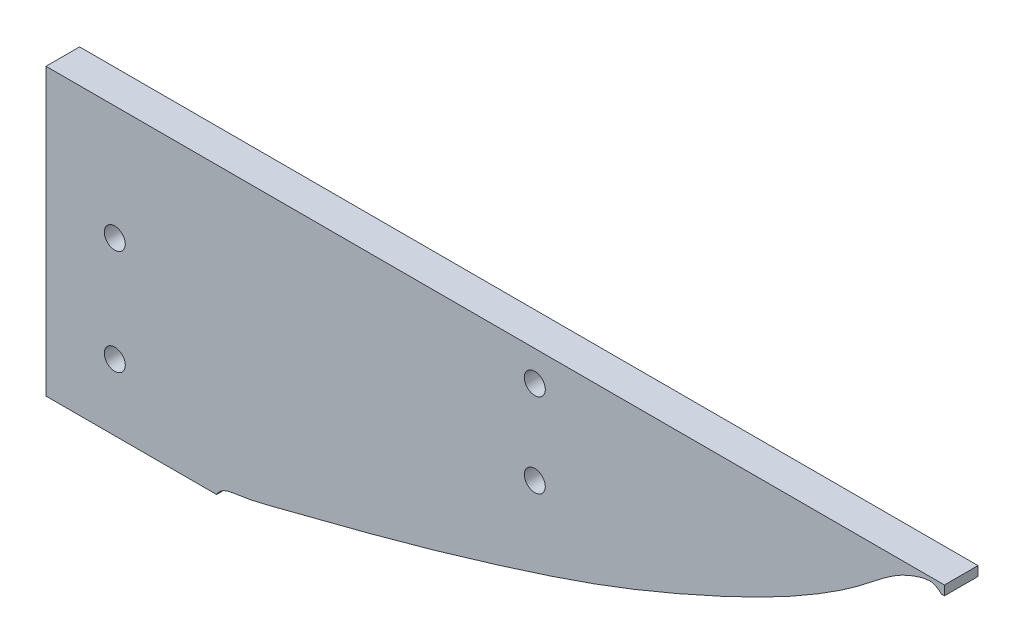
ISO-10303-21;
HEADER;
FILE_DESCRIPTION(('STEP AP214'),'2;1');
FILE_NAME('part.step','',(''),(''),'','','');
FILE_SCHEMA(('AUTOMOTIVE_DESIGN { 1 0 10303 214 1 1 1 1 }'));
ENDSEC;
DATA;
#1=APPLICATION_CONTEXT('core data for automotive mechanical design processes');
#2=APPLICATION_PROTOCOL_DEFINITION('international standard','automotive_design',2000,#1);
#3=PRODUCT_CONTEXT('',#1,'mechanical');
#4=PRODUCT('Part','Part','',(#3));
#5=PRODUCT_RELATED_PRODUCT_CATEGORY('part','',(#4));
#6=PRODUCT_DEFINITION_FORMATION('','',#4);
#7=PRODUCT_DEFINITION_CONTEXT('part definition',#1,'design');
#8=PRODUCT_DEFINITION('design','',#6,#7);
#9=PRODUCT_DEFINITION_SHAPE('','',#8);
#10=(LENGTH_UNIT() NAMED_UNIT(*) SI_UNIT(.MILLI.,.METRE.));
#11=(NAMED_UNIT(*) PLANE_ANGLE_UNIT() SI_UNIT($,.RADIAN.));
#12=(NAMED_UNIT(*) SI_UNIT($,.STERADIAN.) SOLID_ANGLE_UNIT());
#13=UNCERTAINTY_MEASURE_WITH_UNIT(LENGTH_MEASURE(1.E-05),#10,'distance_accuracy_value','');
#14=(GEOMETRIC_REPRESENTATION_CONTEXT(3) GLOBAL_UNCERTAINTY_ASSIGNED_CONTEXT((#13)) GLOBAL_UNIT_ASSIGNED_CONTEXT((#10,
#11,#12)) REPRESENTATION_CONTEXT('',''));
#15=CARTESIAN_POINT('',(0.,0.,0.));
#16=DIRECTION('',(0.,0.,1.));
#17=DIRECTION('',(1.,0.,0.));
#18=AXIS2_PLACEMENT_3D('',#15,#16,#17);
#19=CARTESIAN_POINT('',(-96.0676041626263,-65.803450933749,220.));
#20=DIRECTION('',(0.,0.,-1.));
#21=DIRECTION('',(-1.,0.,0.));
#22=AXIS2_PLACEMENT_3D('',#19,#20,#21);
#23=PLANE('',#22);
#24=CARTESIAN_POINT('',(-100.,-50.,220.));
#25=DIRECTION('',(0.,0.,-1.));
#26=DIRECTION('',(-1.,0.,0.));
#27=AXIS2_PLACEMENT_3D('',#24,#25,#26);
#28=CIRCLE('',#27,2.5);
#29=CARTESIAN_POINT('',(-102.5,-50.,220.));
#30=VERTEX_POINT('',#29);
#31=EDGE_CURVE('E182',#30,#30,#28,.F.);
#32=ORIENTED_EDGE('',*,*,#31,.F.);
#33=EDGE_LOOP('',(#32));
#34=FACE_BOUND('',#33,.T.);
#35=CARTESIAN_POINT('',(0.0705666698621599,-4.96037406111782,220.));
#36=DIRECTION('',(0.,0.,-1.));
#37=DIRECTION('',(-1.,0.,0.));
#38=AXIS2_PLACEMENT_3D('',#35,#36,#37);
#39=CIRCLE('',#38,2.5);
#40=CARTESIAN_POINT('',(-2.42943333013784,-4.96037406111782,220.));
#41=VERTEX_POINT('',#40);
#42=EDGE_CURVE('E160',#41,#41,#39,.F.);
#43=ORIENTED_EDGE('',*,*,#42,.F.);
#44=EDGE_LOOP('',(#43));
#45=FACE_BOUND('',#44,.T.);
#46=DIRECTION('',(-1.,0.,0.));
#47=VECTOR('',#46,1.);
#48=CARTESIAN_POINT('',(97.6718811957973,2.25600000000004,220.));
#49=LINE('',#48,#47);
#50=CARTESIAN_POINT('',(97.6718811957973,2.25600000000004,220.));
#51=VERTEX_POINT('',#50);
#52=CARTESIAN_POINT('',(-116.387505590424,2.25600000000002,220.));
#53=VERTEX_POINT('',#52);
#54=EDGE_CURVE('E162',#51,#53,#49,.T.);
#55=ORIENTED_EDGE('',*,*,#54,.T.);
#56=DIRECTION('',(0.,-1.,0.));
#57=VECTOR('',#56,1.);
#58=CARTESIAN_POINT('',(-116.387505590425,-65.8090437288478,220.));
#59=LINE('',#58,#57);
#60=CARTESIAN_POINT('',(-116.387505590424,-65.8090437288456,220.));
#61=VERTEX_POINT('',#60);
#62=EDGE_CURVE('E86',#53,#61,#59,.T.);
#63=ORIENTED_EDGE('',*,*,#62,.T.);
#64=CARTESIAN_POINT('',(-75.7477041953337,-65.7939819771318,220.));
#65=CARTESIAN_POINT('',(-89.2943034089604,-65.8016703311369,220.));
#66=CARTESIAN_POINT('',(-102.840904429457,-65.8065235902015,220.));
#67=CARTESIAN_POINT('',(-116.387505590424,-65.8090437288456,220.));
#68=B_SPLINE_CURVE_WITH_KNOTS('',3,(#64,#65,#66,#67),.UNSPECIFIED.,.F.,.F.,(4,4),(0.,1.),.UNSPECIFIED.);
#69=CARTESIAN_POINT('',(-75.7477041953337,-65.7939819771319,220.));
#70=VERTEX_POINT('',#69);
#71=EDGE_CURVE('E100',#61,#70,#68,.F.);
#72=ORIENTED_EDGE('',*,*,#71,.T.);
#73=CARTESIAN_POINT('',(96.9016350651795,0.,220.));
#74=CARTESIAN_POINT('',(96.8519426476901,0.115580432964573,220.));
#75=CARTESIAN_POINT('',(96.7671221044327,0.209643179401753,220.));
#76=CARTESIAN_POINT('',(96.5767674993844,0.371275910920587,220.));
#77=CARTESIAN_POINT('',(96.4745875250812,0.442321053647506,220.));
#78=CARTESIAN_POINT('',(96.1693026681454,0.657207746193641,220.));
#79=CARTESIAN_POINT('',(95.9702487323123,0.807385935867797,220.));
#80=CARTESIAN_POINT('',(95.6496859316117,0.999858758834776,220.));
#81=CARTESIAN_POINT('',(95.5408893391914,1.05930922256229,220.));
#82=CARTESIAN_POINT('',(95.3160449660068,1.1606372010778,220.));
#83=CARTESIAN_POINT('',(95.1996320162228,1.20162974415744,220.));
#84=CARTESIAN_POINT('',(94.9593856054094,1.26563153447224,220.));
#85=CARTESIAN_POINT('',(94.8354442643088,1.28864097382315,220.));
#86=CARTESIAN_POINT('',(94.5892813957704,1.31904624620934,220.));
#87=CARTESIAN_POINT('',(94.4659754855689,1.32679461275816,220.));
#88=CARTESIAN_POINT('',(94.0955770629955,1.33407716571005,220.));
#89=CARTESIAN_POINT('',(93.8471649392338,1.31812336366658,220.));
#90=CARTESIAN_POINT('',(93.3536048685711,1.2636145657441,220.));
#91=CARTESIAN_POINT('',(93.1096207271646,1.22614332730666,220.));
#92=CARTESIAN_POINT('',(92.3847475020459,1.08786059021633,220.));
#93=CARTESIAN_POINT('',(91.9110828783317,0.960649253056396,220.));
#94=CARTESIAN_POINT('',(90.9726392580765,0.673756453290501,220.));
#95=CARTESIAN_POINT('',(90.5080638687369,0.51333096313959,220.));
#96=CARTESIAN_POINT('',(89.5873315899863,0.161716847787321,220.));
#97=CARTESIAN_POINT('',(89.1319799253835,-0.0287056040000631,220.));
#98=CARTESIAN_POINT('',(87.7924042462448,-0.634505113679846,220.));
#99=CARTESIAN_POINT('',(86.9302436730784,-1.08770577406354,220.));
#100=CARTESIAN_POINT('',(84.4334177181907,-2.59049724941425,220.));
#101=CARTESIAN_POINT('',(82.8837277820443,-3.77580260681919,220.));
#102=CARTESIAN_POINT('',(80.5798457159318,-5.58674535344837,220.));
#103=CARTESIAN_POINT('',(79.814695595115,-6.19476887542515,220.));
#104=CARTESIAN_POINT('',(78.2723656884322,-7.3924923720122,220.));
#105=CARTESIAN_POINT('',(77.4965656666596,-7.98433573298842,220.));
#106=CARTESIAN_POINT('',(75.1431177743237,-9.72042438339154,220.));
#107=CARTESIAN_POINT('',(73.5383240125928,-10.8235655594466,220.));
#108=CARTESIAN_POINT('',(70.280654815684,-12.9570429870735,220.));
#109=CARTESIAN_POINT('',(68.6282897403805,-13.9881520219005,220.));
#110=CARTESIAN_POINT('',(65.2881491874631,-15.9967519147882,220.));
#111=CARTESIAN_POINT('',(63.5999756789349,-16.973640077298,220.));
#112=CARTESIAN_POINT('',(60.1874334485067,-18.8726098702804,220.));
#113=CARTESIAN_POINT('',(58.4654185994864,-19.7943329413585,220.));
#114=CARTESIAN_POINT('',(53.2664358077166,-22.4921109490717,220.));
#115=CARTESIAN_POINT('',(49.7556400675122,-24.2055662813208,220.));
#116=CARTESIAN_POINT('',(42.6865252467364,-27.5271921669619,220.));
#117=CARTESIAN_POINT('',(39.1257110228588,-29.1335060135173,220.));
#118=CARTESIAN_POINT('',(31.966138282809,-32.2522740454603,220.));
#119=CARTESIAN_POINT('',(28.3672617030794,-33.7657878974137,220.));
#120=CARTESIAN_POINT('',(21.1202291743394,-36.6744065955221,220.));
#121=CARTESIAN_POINT('',(17.4694327724455,-38.0666070753575,220.));
#122=CARTESIAN_POINT('',(10.1229512957571,-40.7156149762488,220.));
#123=CARTESIAN_POINT('',(6.42715248231211,-41.974349060396,220.));
#124=CARTESIAN_POINT('',(-0.992345631584921,-44.4104711345787,220.));
#125=CARTESIAN_POINT('',(-4.7156781915297,-45.5899026583605,220.));
#126=CARTESIAN_POINT('',(-12.1761787893773,-47.9005413199485,220.));
#127=CARTESIAN_POINT('',(-15.9138133458315,-49.0312979978328,220.));
#128=CARTESIAN_POINT('',(-23.4071909849534,-51.232575989077,220.));
#129=CARTESIAN_POINT('',(-27.1636179876737,-52.3015749490052,220.));
#130=CARTESIAN_POINT('',(-34.6925413758234,-54.3802192994758,220.));
#131=CARTESIAN_POINT('',(-38.4650354527324,-55.3905489459171,220.));
#132=CARTESIAN_POINT('',(-46.0184374373603,-57.3790586985937,220.));
#133=CARTESIAN_POINT('',(-49.7988723167312,-58.3590837743564,220.));
#134=CARTESIAN_POINT('',(-55.4705849201684,-59.8249399342256,220.));
#135=CARTESIAN_POINT('',(-57.3616562523801,-60.3116131457572,220.));
#136=CARTESIAN_POINT('',(-60.2001383597751,-61.0342441699398,220.));
#137=CARTESIAN_POINT('',(-61.146613113292,-61.2738875859992,220.));
#138=CARTESIAN_POINT('',(-63.0401604267531,-61.7508262354819,220.));
#139=CARTESIAN_POINT('',(-63.9866690168645,-61.9907683592398,220.));
#140=CARTESIAN_POINT('',(-65.8837594087793,-62.4520084244785,220.));
#141=CARTESIAN_POINT('',(-66.8350179852565,-62.6702125440466,220.));
#142=CARTESIAN_POINT('',(-68.2715899770282,-62.9532060003478,220.));
#143=CARTESIAN_POINT('',(-68.7520477798749,-63.0404306741266,220.));
#144=CARTESIAN_POINT('',(-69.7161461141448,-63.1993834278871,220.));
#145=CARTESIAN_POINT('',(-70.2001060126121,-63.2681421930626,220.));
#146=CARTESIAN_POINT('',(-71.1688081802134,-63.4012712754548,220.));
#147=CARTESIAN_POINT('',(-71.6529122562588,-63.4692213244741,220.));
#148=CARTESIAN_POINT('',(-72.3730687496702,-63.6047992739907,220.));
#149=CARTESIAN_POINT('',(-72.6121498036645,-63.6554390449552,220.));
#150=CARTESIAN_POINT('',(-73.0871744694479,-63.7743170251005,220.));
#151=CARTESIAN_POINT('',(-73.3245358259932,-63.8435241811373,220.));
#152=CARTESIAN_POINT('',(-73.7848114982297,-64.012105977356,220.));
#153=CARTESIAN_POINT('',(-74.0073043108915,-64.111205261717,220.));
#154=CARTESIAN_POINT('',(-74.3242560296515,-64.2923715231059,220.));
#155=CARTESIAN_POINT('',(-74.4270510955057,-64.3582913850557,220.));
#156=CARTESIAN_POINT('',(-74.6261524425066,-64.5026998644083,220.));
#157=CARTESIAN_POINT('',(-74.7229365233919,-64.5810113275943,220.));
#158=CARTESIAN_POINT('',(-75.0027466027724,-64.8245750280937,220.));
#159=CARTESIAN_POINT('',(-75.1734469269677,-65.0030359879642,220.));
#160=CARTESIAN_POINT('',(-75.4265759001549,-65.273694208654,220.));
#161=CARTESIAN_POINT('',(-75.5100934372054,-65.3657353714749,220.));
#162=CARTESIAN_POINT('',(-75.6575606172261,-65.5632982330442,220.));
#163=CARTESIAN_POINT('',(-75.7211614363312,-65.6737730253671,220.));
#164=CARTESIAN_POINT('',(-75.7477041953337,-65.7939819771319,220.));
#165=B_SPLINE_CURVE_WITH_KNOTS('',3,(#73,#74,#75,#76,#77,#78,#79,#80,#81,#82,#83,#84,#85,#86,
#87,#88,#89,#90,#91,#92,#93,#94,#95,#96,#97,#98,#99,#100,#101,#102,#103,#104,#105,#106,#107,
#108,#109,#110,#111,#112,#113,#114,#115,#116,#117,#118,#119,#120,#121,#122,#123,#124,#125,#126,
#127,#128,#129,#130,#131,#132,#133,#134,#135,#136,#137,#138,#139,#140,#141,#142,#143,#144,#145,
#146,#147,#148,#149,#150,#151,#152,#153,#154,#155,#156,#157,#158,#159,#160,#161,#162,#163,#164),
.UNSPECIFIED.,.F.,.F.,(4,2,2,2,2,2,2,2,2,2,2,2,2,2,2,2,2,2,2,2,2,2,2,2,2,2,2,2,2,2,2,2,2,2,2,2,
2,2,2,2,2,2,2,2,2,4),(0.,0.001953125,0.00390625,0.00781250000000011,0.00976562500000011,
0.0117187500000002,0.0136718750000003,0.0156250000000003,0.0195312500000003,0.0234375000000002,
0.0312500000000002,0.0390625000000003,0.0468750000000003,0.0625000000000004,0.0937500000000009,
0.109375000000001,0.125000000000001,0.156250000000001,0.187500000000002,0.218750000000002,
0.250000000000002,0.312500000000002,0.375000000000002,0.437500000000002,0.500000000000003,
0.562500000000003,0.625000000000003,0.687500000000003,0.750000000000003,0.812500000000003,
0.875000000000003,0.906250000000003,0.921875000000003,0.937500000000003,0.953125000000003,
0.960937500000003,0.968750000000003,0.976562500000002,0.980468750000002,0.984375000000002,
0.988281250000002,0.990234375000001,0.992187500000001,0.996093750000001,0.998046875,1.),.UNSPECIFIED.);
#166=CARTESIAN_POINT('',(96.9016350651795,0.,220.));
#167=VERTEX_POINT('',#166);
#168=EDGE_CURVE('E93',#70,#167,#165,.F.);
#169=ORIENTED_EDGE('',*,*,#168,.T.);
#170=DIRECTION('',(1.,0.,0.));
#171=VECTOR('',#170,1.);
#172=CARTESIAN_POINT('',(96.9016350651795,0.,220.));
#173=LINE('',#172,#171);
#174=CARTESIAN_POINT('',(97.6718811957973,0.,220.));
#175=VERTEX_POINT('',#174);
#176=EDGE_CURVE('E98',#167,#175,#173,.T.);
#177=ORIENTED_EDGE('',*,*,#176,.T.);
#178=DIRECTION('',(0.,1.,0.));
#179=VECTOR('',#178,1.);
#180=CARTESIAN_POINT('',(97.6718811957973,2.25600000000004,220.));
#181=LINE('',#180,#179);
#182=EDGE_CURVE('E49',#175,#51,#181,.T.);
#183=ORIENTED_EDGE('',*,*,#182,.T.);
#184=EDGE_LOOP('',(#55,#63,#72,#169,#177,#183));
#185=FACE_BOUND('',#184,.T.);
#186=CARTESIAN_POINT('',(0.0705666698621599,-25.,220.));
#187=DIRECTION('',(0.,0.,-1.));
#188=DIRECTION('',(-1.,0.,0.));
#189=AXIS2_PLACEMENT_3D('',#186,#187,#188);
#190=CIRCLE('',#189,2.5);
#191=CARTESIAN_POINT('',(-2.42943333013784,-25.,220.));
#192=VERTEX_POINT('',#191);
#193=EDGE_CURVE('E178',#192,#192,#190,.F.);
#194=ORIENTED_EDGE('',*,*,#193,.F.);
#195=EDGE_LOOP('',(#194));
#196=FACE_BOUND('',#195,.T.);
#197=CARTESIAN_POINT('',(-100.,-25.,220.));
#198=DIRECTION('',(0.,0.,-1.));
#199=DIRECTION('',(-1.,0.,0.));
#200=AXIS2_PLACEMENT_3D('',#197,#198,#199);
#201=CIRCLE('',#200,2.5);
#202=CARTESIAN_POINT('',(-102.5,-25.,220.));
#203=VERTEX_POINT('',#202);
#204=EDGE_CURVE('E186',#203,#203,#201,.F.);
#205=ORIENTED_EDGE('',*,*,#204,.F.);
#206=EDGE_LOOP('',(#205));
#207=FACE_BOUND('',#206,.T.);
#208=ADVANCED_FACE('F30',(#34,#45,#185,#196,#207),#23,.F.);
#209=CARTESIAN_POINT('',(-96.0676041626263,-65.803450933749,212.));
#210=DIRECTION('',(0.,0.,-1.));
#211=DIRECTION('',(-1.,0.,0.));
#212=AXIS2_PLACEMENT_3D('',#209,#210,#211);
#213=PLANE('',#212);
#214=CARTESIAN_POINT('',(-100.,-50.,212.));
#215=DIRECTION('',(0.,0.,-1.));
#216=DIRECTION('',(-1.,0.,0.));
#217=AXIS2_PLACEMENT_3D('',#214,#215,#216);
#218=CIRCLE('',#217,2.5);
#219=CARTESIAN_POINT('',(-102.5,-50.,212.));
#220=VERTEX_POINT('',#219);
#221=EDGE_CURVE('E185',#220,#220,#218,.F.);
#222=ORIENTED_EDGE('',*,*,#221,.T.);
#223=EDGE_LOOP('',(#222));
#224=FACE_BOUND('',#223,.T.);
#225=CARTESIAN_POINT('',(0.0705666698621599,-4.96037406111782,212.));
#226=DIRECTION('',(0.,0.,-1.));
#227=DIRECTION('',(-1.,0.,0.));
#228=AXIS2_PLACEMENT_3D('',#225,#226,#227);
#229=CIRCLE('',#228,2.5);
#230=CARTESIAN_POINT('',(-2.42943333013784,-4.96037406111782,212.));
#231=VERTEX_POINT('',#230);
#232=EDGE_CURVE('E177',#231,#231,#229,.F.);
#233=ORIENTED_EDGE('',*,*,#232,.T.);
#234=EDGE_LOOP('',(#233));
#235=FACE_BOUND('',#234,.T.);
#236=DIRECTION('',(-1.,0.,0.));
#237=VECTOR('',#236,1.);
#238=CARTESIAN_POINT('',(97.6718811957973,2.25600000000004,212.));
#239=LINE('',#238,#237);
#240=CARTESIAN_POINT('',(97.6718811957973,2.25600000000004,212.));
#241=VERTEX_POINT('',#240);
#242=CARTESIAN_POINT('',(-116.387505590424,2.25600000000002,212.));
#243=VERTEX_POINT('',#242);
#244=EDGE_CURVE('E156',#241,#243,#239,.T.);
#245=ORIENTED_EDGE('',*,*,#244,.F.);
#246=DIRECTION('',(0.,1.,0.));
#247=VECTOR('',#246,1.);
#248=CARTESIAN_POINT('',(97.6718811957973,2.25600000000004,212.));
#249=LINE('',#248,#247);
#250=CARTESIAN_POINT('',(97.6718811957973,0.,212.));
#251=VERTEX_POINT('',#250);
#252=EDGE_CURVE('E78',#251,#241,#249,.T.);
#253=ORIENTED_EDGE('',*,*,#252,.F.);
#254=DIRECTION('',(1.,0.,0.));
#255=VECTOR('',#254,1.);
#256=CARTESIAN_POINT('',(96.9016350651795,0.,212.));
#257=LINE('',#256,#255);
#258=CARTESIAN_POINT('',(96.9016350651795,0.,212.));
#259=VERTEX_POINT('',#258);
#260=EDGE_CURVE('E72',#259,#251,#257,.T.);
#261=ORIENTED_EDGE('',*,*,#260,.F.);
#262=CARTESIAN_POINT('',(-75.7477041953337,-65.7939819771319,212.));
#263=CARTESIAN_POINT('',(-75.7211614363312,-65.6737730253671,212.));
#264=CARTESIAN_POINT('',(-75.6575606172261,-65.5632982330442,212.));
#265=CARTESIAN_POINT('',(-75.5100934372054,-65.3657353714749,212.));
#266=CARTESIAN_POINT('',(-75.4265759001549,-65.273694208654,212.));
#267=CARTESIAN_POINT('',(-75.1734469269677,-65.0030359879642,212.));
#268=CARTESIAN_POINT('',(-75.0027466027724,-64.8245750280937,212.));
#269=CARTESIAN_POINT('',(-74.7229365233919,-64.5810113275943,212.));
#270=CARTESIAN_POINT('',(-74.6261524425066,-64.5026998644083,212.));
#271=CARTESIAN_POINT('',(-74.4270510955057,-64.3582913850557,212.));
#272=CARTESIAN_POINT('',(-74.3242560296515,-64.2923715231059,212.));
#273=CARTESIAN_POINT('',(-74.0073043108915,-64.111205261717,212.));
#274=CARTESIAN_POINT('',(-73.7848114982297,-64.012105977356,212.));
#275=CARTESIAN_POINT('',(-73.3245358259932,-63.8435241811373,212.));
#276=CARTESIAN_POINT('',(-73.0871744694479,-63.7743170251005,212.));
#277=CARTESIAN_POINT('',(-72.6121498036645,-63.6554390449552,212.));
#278=CARTESIAN_POINT('',(-72.3730687496702,-63.6047992739907,212.));
#279=CARTESIAN_POINT('',(-71.6529122562588,-63.4692213244741,212.));
#280=CARTESIAN_POINT('',(-71.1688081802134,-63.4012712754548,212.));
#281=CARTESIAN_POINT('',(-70.2001060126121,-63.2681421930626,212.));
#282=CARTESIAN_POINT('',(-69.7161461141448,-63.1993834278871,212.));
#283=CARTESIAN_POINT('',(-68.7520477798749,-63.0404306741266,212.));
#284=CARTESIAN_POINT('',(-68.2715899770282,-62.9532060003478,212.));
#285=CARTESIAN_POINT('',(-66.8350179852565,-62.6702125440466,212.));
#286=CARTESIAN_POINT('',(-65.8837594087793,-62.4520084244785,212.));
#287=CARTESIAN_POINT('',(-63.9866690168645,-61.9907683592398,212.));
#288=CARTESIAN_POINT('',(-63.0401604267531,-61.7508262354819,212.));
#289=CARTESIAN_POINT('',(-61.146613113292,-61.2738875859992,212.));
#290=CARTESIAN_POINT('',(-60.2001383597751,-61.0342441699398,212.));
#291=CARTESIAN_POINT('',(-57.3616562523801,-60.3116131457572,212.));
#292=CARTESIAN_POINT('',(-55.4705849201684,-59.8249399342256,212.));
#293=CARTESIAN_POINT('',(-49.7988723167312,-58.3590837743564,212.));
#294=CARTESIAN_POINT('',(-46.0184374373603,-57.3790586985937,212.));
#295=CARTESIAN_POINT('',(-38.4650354527324,-55.3905489459171,212.));
#296=CARTESIAN_POINT('',(-34.6925413758234,-54.3802192994758,212.));
#297=CARTESIAN_POINT('',(-27.1636179876737,-52.3015749490052,212.));
#298=CARTESIAN_POINT('',(-23.4071909849534,-51.232575989077,212.));
#299=CARTESIAN_POINT('',(-15.9138133458315,-49.0312979978328,212.));
#300=CARTESIAN_POINT('',(-12.1761787893773,-47.9005413199485,212.));
#301=CARTESIAN_POINT('',(-4.7156781915297,-45.5899026583605,212.));
#302=CARTESIAN_POINT('',(-0.992345631584921,-44.4104711345787,212.));
#303=CARTESIAN_POINT('',(6.42715248231211,-41.974349060396,212.));
#304=CARTESIAN_POINT('',(10.1229512957571,-40.7156149762488,212.));
#305=CARTESIAN_POINT('',(17.4694327724455,-38.0666070753575,212.));
#306=CARTESIAN_POINT('',(21.1202291743394,-36.6744065955221,212.));
#307=CARTESIAN_POINT('',(28.3672617030794,-33.7657878974137,212.));
#308=CARTESIAN_POINT('',(31.966138282809,-32.2522740454603,212.));
#309=CARTESIAN_POINT('',(39.1257110228588,-29.1335060135173,212.));
#310=CARTESIAN_POINT('',(42.6865252467364,-27.5271921669619,212.));
#311=CARTESIAN_POINT('',(49.7556400675122,-24.2055662813208,212.));
#312=CARTESIAN_POINT('',(53.2664358077166,-22.4921109490717,212.));
#313=CARTESIAN_POINT('',(58.4654185994864,-19.7943329413585,212.));
#314=CARTESIAN_POINT('',(60.1874334485067,-18.8726098702804,212.));
#315=CARTESIAN_POINT('',(63.5999756789349,-16.973640077298,212.));
#316=CARTESIAN_POINT('',(65.2881491874631,-15.9967519147882,212.));
#317=CARTESIAN_POINT('',(68.6282897403805,-13.9881520219005,212.));
#318=CARTESIAN_POINT('',(70.280654815684,-12.9570429870735,212.));
#319=CARTESIAN_POINT('',(73.5383240125928,-10.8235655594466,212.));
#320=CARTESIAN_POINT('',(75.1431177743237,-9.72042438339154,212.));
#321=CARTESIAN_POINT('',(77.4965656666596,-7.98433573298842,212.));
#322=CARTESIAN_POINT('',(78.2723656884322,-7.3924923720122,212.));
#323=CARTESIAN_POINT('',(79.814695595115,-6.19476887542515,212.));
#324=CARTESIAN_POINT('',(80.5798457159318,-5.58674535344837,212.));
#325=CARTESIAN_POINT('',(82.8837277820443,-3.77580260681919,212.));
#326=CARTESIAN_POINT('',(84.4334177181907,-2.59049724941425,212.));
#327=CARTESIAN_POINT('',(86.9302436730784,-1.08770577406354,212.));
#328=CARTESIAN_POINT('',(87.7924042462448,-0.634505113679846,212.));
#329=CARTESIAN_POINT('',(89.1319799253835,-0.0287056040000631,212.));
#330=CARTESIAN_POINT('',(89.5873315899863,0.161716847787321,212.));
#331=CARTESIAN_POINT('',(90.5080638687369,0.51333096313959,212.));
#332=CARTESIAN_POINT('',(90.9726392580765,0.673756453290501,212.));
#333=CARTESIAN_POINT('',(91.9110828783317,0.960649253056396,212.));
#334=CARTESIAN_POINT('',(92.3847475020459,1.08786059021633,212.));
#335=CARTESIAN_POINT('',(93.1096207271646,1.22614332730666,212.));
#336=CARTESIAN_POINT('',(93.3536048685711,1.2636145657441,212.));
#337=CARTESIAN_POINT('',(93.8471649392338,1.31812336366658,212.));
#338=CARTESIAN_POINT('',(94.0955770629955,1.33407716571005,212.));
#339=CARTESIAN_POINT('',(94.4659754855689,1.32679461275816,212.));
#340=CARTESIAN_POINT('',(94.5892813957704,1.31904624620934,212.));
#341=CARTESIAN_POINT('',(94.8354442643088,1.28864097382315,212.));
#342=CARTESIAN_POINT('',(94.9593856054094,1.26563153447224,212.));
#343=CARTESIAN_POINT('',(95.1996320162228,1.20162974415744,212.));
#344=CARTESIAN_POINT('',(95.3160449660068,1.1606372010778,212.));
#345=CARTESIAN_POINT('',(95.5408893391914,1.05930922256229,212.));
#346=CARTESIAN_POINT('',(95.6496859316117,0.999858758834776,212.));
#347=CARTESIAN_POINT('',(95.9702487323123,0.807385935867797,212.));
#348=CARTESIAN_POINT('',(96.1693026681454,0.657207746193641,212.));
#349=CARTESIAN_POINT('',(96.4745875250812,0.442321053647506,212.));
#350=CARTESIAN_POINT('',(96.5767674993844,0.371275910920587,212.));
#351=CARTESIAN_POINT('',(96.7671221044327,0.209643179401753,212.));
#352=CARTESIAN_POINT('',(96.8519426476901,0.115580432964573,212.));
#353=CARTESIAN_POINT('',(96.9016350651795,0.,212.));
#354=B_SPLINE_CURVE_WITH_KNOTS('',3,(#262,#263,#264,#265,#266,#267,#268,#269,#270,#271,#272,
#273,#274,#275,#276,#277,#278,#279,#280,#281,#282,#283,#284,#285,#286,#287,#288,#289,#290,#291,
#292,#293,#294,#295,#296,#297,#298,#299,#300,#301,#302,#303,#304,#305,#306,#307,#308,#309,#310,
#311,#312,#313,#314,#315,#316,#317,#318,#319,#320,#321,#322,#323,#324,#325,#326,#327,#328,#329,
#330,#331,#332,#333,#334,#335,#336,#337,#338,#339,#340,#341,#342,#343,#344,#345,#346,#347,#348,
#349,#350,#351,#352,#353),.UNSPECIFIED.,.F.,.F.,(4,2,2,2,2,2,2,2,2,2,2,2,2,2,2,2,2,2,2,2,2,2,2,
2,2,2,2,2,2,2,2,2,2,2,2,2,2,2,2,2,2,2,2,2,2,4),(0.,0.00195312499999967,0.00390624999999944,
0.00781249999999878,0.00976562499999856,0.0117187499999983,0.0156249999999981,
0.0195312499999978,0.0234374999999976,0.0312499999999973,0.0390624999999971,0.046874999999997,
0.0624999999999969,0.0781249999999969,0.0937499999999969,0.124999999999997,0.187499999999997,
0.249999999999997,0.312499999999997,0.374999999999997,0.437499999999997,0.499999999999997,
0.562499999999998,0.624999999999998,0.687499999999998,0.749999999999998,0.781249999999998,
0.812499999999998,0.843749999999999,0.874999999999999,0.890624999999999,0.906249999999999,
0.9375,0.953125,0.9609375,0.96875,0.9765625,0.98046875,0.984375,0.986328125,0.98828125,
0.990234375,0.9921875,0.99609375,0.998046875,1.),.UNSPECIFIED.);
#355=CARTESIAN_POINT('',(-75.7477041953337,-65.7939819771319,212.));
#356=VERTEX_POINT('',#355);
#357=EDGE_CURVE('E110',#356,#259,#354,.T.);
#358=ORIENTED_EDGE('',*,*,#357,.F.);
#359=CARTESIAN_POINT('',(-116.387505590424,-65.8090437288456,212.));
#360=CARTESIAN_POINT('',(-102.840904429457,-65.8065235902015,212.));
#361=CARTESIAN_POINT('',(-89.2943034089604,-65.8016703311369,212.));
#362=CARTESIAN_POINT('',(-75.7477041953337,-65.7939819771318,212.));
#363=B_SPLINE_CURVE_WITH_KNOTS('',3,(#359,#360,#361,#362),.UNSPECIFIED.,.F.,.F.,(4,4),(0.,1.),.UNSPECIFIED.);
#364=CARTESIAN_POINT('',(-116.387505590424,-65.8090437288456,212.));
#365=VERTEX_POINT('',#364);
#366=EDGE_CURVE('E250',#365,#356,#363,.T.);
#367=ORIENTED_EDGE('',*,*,#366,.F.);
#368=DIRECTION('',(0.,-1.,0.));
#369=VECTOR('',#368,1.);
#370=CARTESIAN_POINT('',(-116.387505590425,-65.8090437288478,212.));
#371=LINE('',#370,#369);
#372=EDGE_CURVE('E159',#243,#365,#371,.T.);
#373=ORIENTED_EDGE('',*,*,#372,.F.);
#374=EDGE_LOOP('',(#245,#253,#261,#358,#367,#373));
#375=FACE_BOUND('',#374,.T.);
#376=CARTESIAN_POINT('',(0.0705666698621599,-25.,212.));
#377=DIRECTION('',(0.,0.,-1.));
#378=DIRECTION('',(-1.,0.,0.));
#379=AXIS2_PLACEMENT_3D('',#376,#377,#378);
#380=CIRCLE('',#379,2.5);
#381=CARTESIAN_POINT('',(-2.42943333013784,-25.,212.));
#382=VERTEX_POINT('',#381);
#383=EDGE_CURVE('E181',#382,#382,#380,.F.);
#384=ORIENTED_EDGE('',*,*,#383,.T.);
#385=EDGE_LOOP('',(#384));
#386=FACE_BOUND('',#385,.T.);
#387=CARTESIAN_POINT('',(-100.,-25.,212.));
#388=DIRECTION('',(0.,0.,-1.));
#389=DIRECTION('',(-1.,0.,0.));
#390=AXIS2_PLACEMENT_3D('',#387,#388,#389);
#391=CIRCLE('',#390,2.5);
#392=CARTESIAN_POINT('',(-102.5,-25.,212.));
#393=VERTEX_POINT('',#392);
#394=EDGE_CURVE('E34',#393,#393,#391,.F.);
#395=ORIENTED_EDGE('',*,*,#394,.T.);
#396=EDGE_LOOP('',(#395));
#397=FACE_BOUND('',#396,.T.);
#398=ADVANCED_FACE('F167',(#224,#235,#375,#386,#397),#213,.T.);
#399=CARTESIAN_POINT('',(97.6718811957973,2.25600000000004,220.));
#400=DIRECTION('',(0.,-1.,0.));
#401=DIRECTION('',(1.,0.,0.));
#402=AXIS2_PLACEMENT_3D('',#399,#400,#401);
#403=PLANE('',#402);
#404=ORIENTED_EDGE('',*,*,#244,.T.);
#405=DIRECTION('',(0.,0.,-1.));
#406=VECTOR('',#405,1.);
#407=CARTESIAN_POINT('',(-116.387505590424,2.25600000000002,220.));
#408=LINE('',#407,#406);
#409=EDGE_CURVE('E11',#53,#243,#408,.T.);
#410=ORIENTED_EDGE('',*,*,#409,.F.);
#411=ORIENTED_EDGE('',*,*,#54,.F.);
#412=DIRECTION('',(0.,0.,-1.));
#413=VECTOR('',#412,1.);
#414=CARTESIAN_POINT('',(97.6718811957973,2.25600000000004,220.));
#415=LINE('',#414,#413);
#416=EDGE_CURVE('E117',#51,#241,#415,.T.);
#417=ORIENTED_EDGE('',*,*,#416,.T.);
#418=EDGE_LOOP('',(#404,#410,#411,#417));
#419=FACE_BOUND('',#418,.T.);
#420=ADVANCED_FACE('F32',(#419),#403,.F.);
#421=CARTESIAN_POINT('',(-116.387505590425,-65.8090437288478,220.));
#422=DIRECTION('',(1.,0.,0.));
#423=DIRECTION('',(0.,1.,0.));
#424=AXIS2_PLACEMENT_3D('',#421,#422,#423);
#425=PLANE('',#424);
#426=ORIENTED_EDGE('',*,*,#372,.T.);
#427=DIRECTION('',(0.,0.,-1.));
#428=VECTOR('',#427,1.);
#429=CARTESIAN_POINT('',(-116.387505590424,-65.8090437288456,220.));
#430=LINE('',#429,#428);
#431=EDGE_CURVE('E40',#61,#365,#430,.T.);
#432=ORIENTED_EDGE('',*,*,#431,.F.);
#433=ORIENTED_EDGE('',*,*,#62,.F.);
#434=ORIENTED_EDGE('',*,*,#409,.T.);
#435=EDGE_LOOP('',(#426,#432,#433,#434));
#436=FACE_BOUND('',#435,.T.);
#437=ADVANCED_FACE('F308',(#436),#425,.F.);
#438=CARTESIAN_POINT('',(-116.387505590424,-65.8090437288456,220.));
#439=CARTESIAN_POINT('',(-102.840904429457,-65.8065235902015,220.));
#440=CARTESIAN_POINT('',(-89.2943034089604,-65.8016703311369,220.));
#441=CARTESIAN_POINT('',(-75.7477041953337,-65.7939819771318,220.));
#442=B_SPLINE_CURVE_WITH_KNOTS('',3,(#438,#439,#440,#441),.UNSPECIFIED.,.F.,.F.,(4,4),(0.,1.),.UNSPECIFIED.);
#443=DIRECTION('',(0.,0.,-1.));
#444=VECTOR('',#443,1.);
#445=SURFACE_OF_LINEAR_EXTRUSION('',#442,#444);
#446=ORIENTED_EDGE('',*,*,#366,.T.);
#447=DIRECTION('',(0.,0.,-1.));
#448=VECTOR('',#447,1.);
#449=CARTESIAN_POINT('',(-75.7477041953337,-65.7939819771319,220.));
#450=LINE('',#449,#448);
#451=EDGE_CURVE('E112',#70,#356,#450,.T.);
#452=ORIENTED_EDGE('',*,*,#451,.F.);
#453=ORIENTED_EDGE('',*,*,#71,.F.);
#454=ORIENTED_EDGE('',*,*,#431,.T.);
#455=EDGE_LOOP('',(#446,#452,#453,#454));
#456=FACE_BOUND('',#455,.T.);
#457=ADVANCED_FACE('F139',(#456),#445,.F.);
#458=CARTESIAN_POINT('',(-75.7477041953337,-65.7939819771319,220.));
#459=CARTESIAN_POINT('',(-75.7211614363312,-65.6737730253671,220.));
#460=CARTESIAN_POINT('',(-75.6575606172261,-65.5632982330442,220.));
#461=CARTESIAN_POINT('',(-75.5100934372054,-65.3657353714749,220.));
#462=CARTESIAN_POINT('',(-75.4265759001549,-65.273694208654,220.));
#463=CARTESIAN_POINT('',(-75.1734469269677,-65.0030359879642,220.));
#464=CARTESIAN_POINT('',(-75.0027466027724,-64.8245750280937,220.));
#465=CARTESIAN_POINT('',(-74.7229365233919,-64.5810113275943,220.));
#466=CARTESIAN_POINT('',(-74.6261524425066,-64.5026998644083,220.));
#467=CARTESIAN_POINT('',(-74.4270510955057,-64.3582913850557,220.));
#468=CARTESIAN_POINT('',(-74.3242560296515,-64.2923715231059,220.));
#469=CARTESIAN_POINT('',(-74.0073043108915,-64.111205261717,220.));
#470=CARTESIAN_POINT('',(-73.7848114982297,-64.012105977356,220.));
#471=CARTESIAN_POINT('',(-73.3245358259932,-63.8435241811373,220.));
#472=CARTESIAN_POINT('',(-73.0871744694479,-63.7743170251005,220.));
#473=CARTESIAN_POINT('',(-72.6121498036645,-63.6554390449552,220.));
#474=CARTESIAN_POINT('',(-72.3730687496702,-63.6047992739907,220.));
#475=CARTESIAN_POINT('',(-71.6529122562588,-63.4692213244741,220.));
#476=CARTESIAN_POINT('',(-71.1688081802134,-63.4012712754548,220.));
#477=CARTESIAN_POINT('',(-70.2001060126121,-63.2681421930626,220.));
#478=CARTESIAN_POINT('',(-69.7161461141448,-63.1993834278871,220.));
#479=CARTESIAN_POINT('',(-68.7520477798749,-63.0404306741266,220.));
#480=CARTESIAN_POINT('',(-68.2715899770282,-62.9532060003478,220.));
#481=CARTESIAN_POINT('',(-66.8350179852565,-62.6702125440466,220.));
#482=CARTESIAN_POINT('',(-65.8837594087793,-62.4520084244785,220.));
#483=CARTESIAN_POINT('',(-63.9866690168645,-61.9907683592398,220.));
#484=CARTESIAN_POINT('',(-63.0401604267531,-61.7508262354819,220.));
#485=CARTESIAN_POINT('',(-61.146613113292,-61.2738875859992,220.));
#486=CARTESIAN_POINT('',(-60.2001383597751,-61.0342441699398,220.));
#487=CARTESIAN_POINT('',(-57.3616562523801,-60.3116131457572,220.));
#488=CARTESIAN_POINT('',(-55.4705849201684,-59.8249399342256,220.));
#489=CARTESIAN_POINT('',(-49.7988723167312,-58.3590837743564,220.));
#490=CARTESIAN_POINT('',(-46.0184374373603,-57.3790586985937,220.));
#491=CARTESIAN_POINT('',(-38.4650354527324,-55.3905489459171,220.));
#492=CARTESIAN_POINT('',(-34.6925413758234,-54.3802192994758,220.));
#493=CARTESIAN_POINT('',(-27.1636179876737,-52.3015749490052,220.));
#494=CARTESIAN_POINT('',(-23.4071909849534,-51.232575989077,220.));
#495=CARTESIAN_POINT('',(-15.9138133458315,-49.0312979978328,220.));
#496=CARTESIAN_POINT('',(-12.1761787893773,-47.9005413199485,220.));
#497=CARTESIAN_POINT('',(-4.7156781915297,-45.5899026583605,220.));
#498=CARTESIAN_POINT('',(-0.992345631584921,-44.4104711345787,220.));
#499=CARTESIAN_POINT('',(6.42715248231211,-41.974349060396,220.));
#500=CARTESIAN_POINT('',(10.1229512957571,-40.7156149762488,220.));
#501=CARTESIAN_POINT('',(17.4694327724455,-38.0666070753575,220.));
#502=CARTESIAN_POINT('',(21.1202291743394,-36.6744065955221,220.));
#503=CARTESIAN_POINT('',(28.3672617030794,-33.7657878974137,220.));
#504=CARTESIAN_POINT('',(31.966138282809,-32.2522740454603,220.));
#505=CARTESIAN_POINT('',(39.1257110228588,-29.1335060135173,220.));
#506=CARTESIAN_POINT('',(42.6865252467364,-27.5271921669619,220.));
#507=CARTESIAN_POINT('',(49.7556400675122,-24.2055662813208,220.));
#508=CARTESIAN_POINT('',(53.2664358077166,-22.4921109490717,220.));
#509=CARTESIAN_POINT('',(58.4654185994864,-19.7943329413585,220.));
#510=CARTESIAN_POINT('',(60.1874334485067,-18.8726098702804,220.));
#511=CARTESIAN_POINT('',(63.5999756789349,-16.973640077298,220.));
#512=CARTESIAN_POINT('',(65.2881491874631,-15.9967519147882,220.));
#513=CARTESIAN_POINT('',(68.6282897403805,-13.9881520219005,220.));
#514=CARTESIAN_POINT('',(70.280654815684,-12.9570429870735,220.));
#515=CARTESIAN_POINT('',(73.5383240125928,-10.8235655594466,220.));
#516=CARTESIAN_POINT('',(75.1431177743237,-9.72042438339154,220.));
#517=CARTESIAN_POINT('',(77.4965656666596,-7.98433573298842,220.));
#518=CARTESIAN_POINT('',(78.2723656884322,-7.3924923720122,220.));
#519=CARTESIAN_POINT('',(79.814695595115,-6.19476887542515,220.));
#520=CARTESIAN_POINT('',(80.5798457159318,-5.58674535344837,220.));
#521=CARTESIAN_POINT('',(82.8837277820443,-3.77580260681919,220.));
#522=CARTESIAN_POINT('',(84.4334177181907,-2.59049724941425,220.));
#523=CARTESIAN_POINT('',(86.9302436730784,-1.08770577406354,220.));
#524=CARTESIAN_POINT('',(87.7924042462448,-0.634505113679846,220.));
#525=CARTESIAN_POINT('',(89.1319799253835,-0.0287056040000631,220.));
#526=CARTESIAN_POINT('',(89.5873315899863,0.161716847787321,220.));
#527=CARTESIAN_POINT('',(90.5080638687369,0.51333096313959,220.));
#528=CARTESIAN_POINT('',(90.9726392580765,0.673756453290501,220.));
#529=CARTESIAN_POINT('',(91.9110828783317,0.960649253056396,220.));
#530=CARTESIAN_POINT('',(92.3847475020459,1.08786059021633,220.));
#531=CARTESIAN_POINT('',(93.1096207271646,1.22614332730666,220.));
#532=CARTESIAN_POINT('',(93.3536048685711,1.2636145657441,220.));
#533=CARTESIAN_POINT('',(93.8471649392338,1.31812336366658,220.));
#534=CARTESIAN_POINT('',(94.0955770629955,1.33407716571005,220.));
#535=CARTESIAN_POINT('',(94.4659754855689,1.32679461275816,220.));
#536=CARTESIAN_POINT('',(94.5892813957704,1.31904624620934,220.));
#537=CARTESIAN_POINT('',(94.8354442643088,1.28864097382315,220.));
#538=CARTESIAN_POINT('',(94.9593856054094,1.26563153447224,220.));
#539=CARTESIAN_POINT('',(95.1996320162228,1.20162974415744,220.));
#540=CARTESIAN_POINT('',(95.3160449660068,1.1606372010778,220.));
#541=CARTESIAN_POINT('',(95.5408893391914,1.05930922256229,220.));
#542=CARTESIAN_POINT('',(95.6496859316117,0.999858758834776,220.));
#543=CARTESIAN_POINT('',(95.9702487323123,0.807385935867797,220.));
#544=CARTESIAN_POINT('',(96.1693026681454,0.657207746193641,220.));
#545=CARTESIAN_POINT('',(96.4745875250812,0.442321053647506,220.));
#546=CARTESIAN_POINT('',(96.5767674993844,0.371275910920587,220.));
#547=CARTESIAN_POINT('',(96.7671221044327,0.209643179401753,220.));
#548=CARTESIAN_POINT('',(96.8519426476901,0.115580432964573,220.));
#549=CARTESIAN_POINT('',(96.9016350651795,0.,220.));
#550=B_SPLINE_CURVE_WITH_KNOTS('',3,(#458,#459,#460,#461,#462,#463,#464,#465,#466,#467,#468,
#469,#470,#471,#472,#473,#474,#475,#476,#477,#478,#479,#480,#481,#482,#483,#484,#485,#486,#487,
#488,#489,#490,#491,#492,#493,#494,#495,#496,#497,#498,#499,#500,#501,#502,#503,#504,#505,#506,
#507,#508,#509,#510,#511,#512,#513,#514,#515,#516,#517,#518,#519,#520,#521,#522,#523,#524,#525,
#526,#527,#528,#529,#530,#531,#532,#533,#534,#535,#536,#537,#538,#539,#540,#541,#542,#543,#544,
#545,#546,#547,#548,#549),.UNSPECIFIED.,.F.,.F.,(4,2,2,2,2,2,2,2,2,2,2,2,2,2,2,2,2,2,2,2,2,2,2,
2,2,2,2,2,2,2,2,2,2,2,2,2,2,2,2,2,2,2,2,2,2,4),(0.,0.00195312499999967,0.00390624999999944,
0.00781249999999878,0.00976562499999856,0.0117187499999983,0.0156249999999981,
0.0195312499999978,0.0234374999999976,0.0312499999999973,0.0390624999999971,0.046874999999997,
0.0624999999999969,0.0781249999999969,0.0937499999999969,0.124999999999997,0.187499999999997,
0.249999999999997,0.312499999999997,0.374999999999997,0.437499999999997,0.499999999999997,
0.562499999999998,0.624999999999998,0.687499999999998,0.749999999999998,0.781249999999998,
0.812499999999998,0.843749999999999,0.874999999999999,0.890624999999999,0.906249999999999,
0.9375,0.953125,0.9609375,0.96875,0.9765625,0.98046875,0.984375,0.986328125,0.98828125,
0.990234375,0.9921875,0.99609375,0.998046875,1.),.UNSPECIFIED.);
#551=DIRECTION('',(0.,0.,-1.));
#552=VECTOR('',#551,1.);
#553=SURFACE_OF_LINEAR_EXTRUSION('',#550,#552);
#554=ORIENTED_EDGE('',*,*,#357,.T.);
#555=DIRECTION('',(0.,0.,-1.));
#556=VECTOR('',#555,1.);
#557=CARTESIAN_POINT('',(96.9016350651795,0.,220.));
#558=LINE('',#557,#556);
#559=EDGE_CURVE('E107',#167,#259,#558,.T.);
#560=ORIENTED_EDGE('',*,*,#559,.F.);
#561=ORIENTED_EDGE('',*,*,#168,.F.);
#562=ORIENTED_EDGE('',*,*,#451,.T.);
#563=EDGE_LOOP('',(#554,#560,#561,#562));
#564=FACE_BOUND('',#563,.T.);
#565=ADVANCED_FACE('F108',(#564),#553,.F.);
#566=CARTESIAN_POINT('',(96.9016350651795,0.,220.));
#567=DIRECTION('',(0.,1.,0.));
#568=DIRECTION('',(-1.,0.,0.));
#569=AXIS2_PLACEMENT_3D('',#566,#567,#568);
#570=PLANE('',#569);
#571=ORIENTED_EDGE('',*,*,#260,.T.);
#572=DIRECTION('',(0.,0.,-1.));
#573=VECTOR('',#572,1.);
#574=CARTESIAN_POINT('',(97.6718811957973,0.,220.));
#575=LINE('',#574,#573);
#576=EDGE_CURVE('E113',#175,#251,#575,.T.);
#577=ORIENTED_EDGE('',*,*,#576,.F.);
#578=ORIENTED_EDGE('',*,*,#176,.F.);
#579=ORIENTED_EDGE('',*,*,#559,.T.);
#580=EDGE_LOOP('',(#571,#577,#578,#579));
#581=FACE_BOUND('',#580,.T.);
#582=ADVANCED_FACE('F115',(#581),#570,.F.);
#583=CARTESIAN_POINT('',(97.6718811957973,2.25600000000004,220.));
#584=DIRECTION('',(-1.,0.,0.));
#585=DIRECTION('',(0.,0.,1.));
#586=AXIS2_PLACEMENT_3D('',#583,#584,#585);
#587=PLANE('',#586);
#588=ORIENTED_EDGE('',*,*,#252,.T.);
#589=ORIENTED_EDGE('',*,*,#416,.F.);
#590=ORIENTED_EDGE('',*,*,#182,.F.);
#591=ORIENTED_EDGE('',*,*,#576,.T.);
#592=EDGE_LOOP('',(#588,#589,#590,#591));
#593=FACE_BOUND('',#592,.T.);
#594=ADVANCED_FACE('F164',(#593),#587,.F.);
#595=CARTESIAN_POINT('',(0.0705666698621599,-4.96037406111782,308.));
#596=DIRECTION('',(0.,0.,-1.));
#597=DIRECTION('',(-1.,0.,0.));
#598=AXIS2_PLACEMENT_3D('',#595,#596,#597);
#599=CYLINDRICAL_SURFACE('',#598,2.5);
#600=ORIENTED_EDGE('',*,*,#232,.F.);
#601=EDGE_LOOP('',(#600));
#602=FACE_BOUND('',#601,.T.);
#603=ORIENTED_EDGE('',*,*,#42,.T.);
#604=EDGE_LOOP('',(#603));
#605=FACE_BOUND('',#604,.T.);
#606=ADVANCED_FACE('F217',(#602,#605),#599,.F.);
#607=CARTESIAN_POINT('',(0.0705666698621599,-25.,308.));
#608=DIRECTION('',(0.,0.,-1.));
#609=DIRECTION('',(-1.,0.,0.));
#610=AXIS2_PLACEMENT_3D('',#607,#608,#609);
#611=CYLINDRICAL_SURFACE('',#610,2.5);
#612=ORIENTED_EDGE('',*,*,#383,.F.);
#613=EDGE_LOOP('',(#612));
#614=FACE_BOUND('',#613,.T.);
#615=ORIENTED_EDGE('',*,*,#193,.T.);
#616=EDGE_LOOP('',(#615));
#617=FACE_BOUND('',#616,.T.);
#618=ADVANCED_FACE('F202',(#614,#617),#611,.F.);
#619=CARTESIAN_POINT('',(-100.,-50.,308.));
#620=DIRECTION('',(0.,0.,-1.));
#621=DIRECTION('',(-1.,0.,0.));
#622=AXIS2_PLACEMENT_3D('',#619,#620,#621);
#623=CYLINDRICAL_SURFACE('',#622,2.5);
#624=ORIENTED_EDGE('',*,*,#221,.F.);
#625=EDGE_LOOP('',(#624));
#626=FACE_BOUND('',#625,.T.);
#627=ORIENTED_EDGE('',*,*,#31,.T.);
#628=EDGE_LOOP('',(#627));
#629=FACE_BOUND('',#628,.T.);
#630=ADVANCED_FACE('F197',(#626,#629),#623,.F.);
#631=CARTESIAN_POINT('',(-100.,-25.,308.));
#632=DIRECTION('',(0.,0.,-1.));
#633=DIRECTION('',(-1.,0.,0.));
#634=AXIS2_PLACEMENT_3D('',#631,#632,#633);
#635=CYLINDRICAL_SURFACE('',#634,2.5);
#636=ORIENTED_EDGE('',*,*,#394,.F.);
#637=EDGE_LOOP('',(#636));
#638=FACE_BOUND('',#637,.T.);
#639=ORIENTED_EDGE('',*,*,#204,.T.);
#640=EDGE_LOOP('',(#639));
#641=FACE_BOUND('',#640,.T.);
#642=ADVANCED_FACE('F195',(#638,#641),#635,.F.);
#643=CLOSED_SHELL('',(#208,#398,#420,#437,#457,#565,#582,#594,#606,#618,#630,#642));
#644=MANIFOLD_SOLID_BREP('B2',#643);
#645=ADVANCED_BREP_SHAPE_REPRESENTATION('',(#18,#644),#14);
#646=SHAPE_DEFINITION_REPRESENTATION(#9,#645);
ENDSEC;
END-ISO-10303-21;
